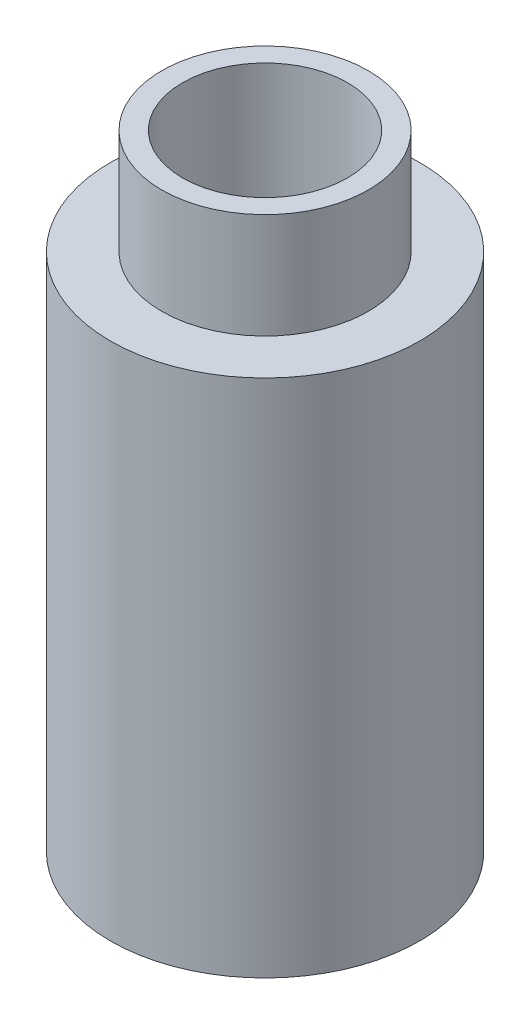
ISO-10303-21;
HEADER;
FILE_DESCRIPTION(('STEP AP214'),'2;1');
FILE_NAME('part.step','',(''),(''),'','','');
FILE_SCHEMA(('AUTOMOTIVE_DESIGN { 1 0 10303 214 1 1 1 1 }'));
ENDSEC;
DATA;
#1=APPLICATION_CONTEXT('core data for automotive mechanical design processes');
#2=APPLICATION_PROTOCOL_DEFINITION('international standard','automotive_design',2000,#1);
#3=PRODUCT_CONTEXT('',#1,'mechanical');
#4=PRODUCT('Part','Part','',(#3));
#5=PRODUCT_RELATED_PRODUCT_CATEGORY('part','',(#4));
#6=PRODUCT_DEFINITION_FORMATION('','',#4);
#7=PRODUCT_DEFINITION_CONTEXT('part definition',#1,'design');
#8=PRODUCT_DEFINITION('design','',#6,#7);
#9=PRODUCT_DEFINITION_SHAPE('','',#8);
#10=(LENGTH_UNIT() NAMED_UNIT(*) SI_UNIT(.MILLI.,.METRE.));
#11=(NAMED_UNIT(*) PLANE_ANGLE_UNIT() SI_UNIT($,.RADIAN.));
#12=(NAMED_UNIT(*) SI_UNIT($,.STERADIAN.) SOLID_ANGLE_UNIT());
#13=UNCERTAINTY_MEASURE_WITH_UNIT(LENGTH_MEASURE(1.E-05),#10,'distance_accuracy_value','');
#14=(GEOMETRIC_REPRESENTATION_CONTEXT(3) GLOBAL_UNCERTAINTY_ASSIGNED_CONTEXT((#13)) GLOBAL_UNIT_ASSIGNED_CONTEXT((#10,
#11,#12)) REPRESENTATION_CONTEXT('',''));
#15=CARTESIAN_POINT('',(0.,0.,0.));
#16=DIRECTION('',(0.,0.,1.));
#17=DIRECTION('',(1.,0.,0.));
#18=AXIS2_PLACEMENT_3D('',#15,#16,#17);
#19=CARTESIAN_POINT('',(0.,31.75,0.));
#20=DIRECTION('',(0.,1.,0.));
#21=DIRECTION('',(0.,0.,1.));
#22=AXIS2_PLACEMENT_3D('',#19,#20,#21);
#23=PLANE('',#22);
#24=CARTESIAN_POINT('',(0.,31.75,0.));
#25=DIRECTION('',(0.,1.,0.));
#26=DIRECTION('',(0.,0.,1.));
#27=AXIS2_PLACEMENT_3D('',#24,#25,#26);
#28=CIRCLE('',#27,9.4488);
#29=CARTESIAN_POINT('',(0.,31.75,9.4488));
#30=VERTEX_POINT('',#29);
#31=EDGE_CURVE('E10',#30,#30,#28,.T.);
#32=ORIENTED_EDGE('',*,*,#31,.T.);
#33=EDGE_LOOP('',(#32));
#34=FACE_BOUND('',#33,.T.);
#35=CARTESIAN_POINT('',(0.,31.75,0.));
#36=DIRECTION('',(0.,1.,0.));
#37=DIRECTION('',(0.,0.,1.));
#38=AXIS2_PLACEMENT_3D('',#35,#36,#37);
#39=CIRCLE('',#38,6.3119);
#40=CARTESIAN_POINT('',(0.,31.75,6.3119));
#41=VERTEX_POINT('',#40);
#42=EDGE_CURVE('E44',#41,#41,#39,.T.);
#43=ORIENTED_EDGE('',*,*,#42,.F.);
#44=EDGE_LOOP('',(#43));
#45=FACE_BOUND('',#44,.T.);
#46=ADVANCED_FACE('F31',(#34,#45),#23,.T.);
#47=CARTESIAN_POINT('',(0.,31.75,0.));
#48=DIRECTION('',(0.,-1.,0.));
#49=DIRECTION('',(0.,0.,-1.));
#50=AXIS2_PLACEMENT_3D('',#47,#48,#49);
#51=CYLINDRICAL_SURFACE('',#50,9.4488);
#52=ORIENTED_EDGE('',*,*,#31,.F.);
#53=EDGE_LOOP('',(#52));
#54=FACE_BOUND('',#53,.T.);
#55=CARTESIAN_POINT('',(0.,0.,0.));
#56=DIRECTION('',(0.,1.,0.));
#57=DIRECTION('',(0.,0.,1.));
#58=AXIS2_PLACEMENT_3D('',#55,#56,#57);
#59=CIRCLE('',#58,9.4488);
#60=CARTESIAN_POINT('',(0.,0.,9.4488));
#61=VERTEX_POINT('',#60);
#62=EDGE_CURVE('E35',#61,#61,#59,.T.);
#63=ORIENTED_EDGE('',*,*,#62,.T.);
#64=EDGE_LOOP('',(#63));
#65=FACE_BOUND('',#64,.T.);
#66=ADVANCED_FACE('F33',(#54,#65),#51,.T.);
#67=CARTESIAN_POINT('',(0.,0.,0.));
#68=DIRECTION('',(0.,1.,0.));
#69=DIRECTION('',(0.,0.,1.));
#70=AXIS2_PLACEMENT_3D('',#67,#68,#69);
#71=PLANE('',#70);
#72=CARTESIAN_POINT('',(0.,0.,0.));
#73=DIRECTION('',(0.,1.,0.));
#74=DIRECTION('',(0.,0.,1.));
#75=AXIS2_PLACEMENT_3D('',#72,#73,#74);
#76=CIRCLE('',#75,5.0419);
#77=CARTESIAN_POINT('',(0.,0.,5.0419));
#78=VERTEX_POINT('',#77);
#79=EDGE_CURVE('E47',#78,#78,#76,.T.);
#80=ORIENTED_EDGE('',*,*,#79,.T.);
#81=EDGE_LOOP('',(#80));
#82=FACE_BOUND('',#81,.T.);
#83=ORIENTED_EDGE('',*,*,#62,.F.);
#84=EDGE_LOOP('',(#83));
#85=FACE_BOUND('',#84,.T.);
#86=ADVANCED_FACE('F56',(#82,#85),#71,.F.);
#87=CARTESIAN_POINT('',(0.,38.1762,0.));
#88=DIRECTION('',(0.,-1.,0.));
#89=DIRECTION('',(0.,0.,-1.));
#90=AXIS2_PLACEMENT_3D('',#87,#88,#89);
#91=CYLINDRICAL_SURFACE('',#90,6.3119);
#92=CARTESIAN_POINT('',(0.,38.1762,0.));
#93=DIRECTION('',(0.,1.,0.));
#94=DIRECTION('',(0.,0.,1.));
#95=AXIS2_PLACEMENT_3D('',#92,#93,#94);
#96=CIRCLE('',#95,6.3119);
#97=CARTESIAN_POINT('',(0.,38.1762,6.3119));
#98=VERTEX_POINT('',#97);
#99=EDGE_CURVE('E42',#98,#98,#96,.T.);
#100=ORIENTED_EDGE('',*,*,#99,.F.);
#101=EDGE_LOOP('',(#100));
#102=FACE_BOUND('',#101,.T.);
#103=ORIENTED_EDGE('',*,*,#42,.T.);
#104=EDGE_LOOP('',(#103));
#105=FACE_BOUND('',#104,.T.);
#106=ADVANCED_FACE('F68',(#102,#105),#91,.T.);
#107=CARTESIAN_POINT('',(0.,38.1762,0.));
#108=DIRECTION('',(0.,1.,0.));
#109=DIRECTION('',(0.,0.,1.));
#110=AXIS2_PLACEMENT_3D('',#107,#108,#109);
#111=PLANE('',#110);
#112=CARTESIAN_POINT('',(0.,38.1762,0.));
#113=DIRECTION('',(0.,1.,0.));
#114=DIRECTION('',(0.,0.,1.));
#115=AXIS2_PLACEMENT_3D('',#112,#113,#114);
#116=CIRCLE('',#115,5.0419);
#117=CARTESIAN_POINT('',(0.,38.1762,5.0419));
#118=VERTEX_POINT('',#117);
#119=EDGE_CURVE('E50',#118,#118,#116,.T.);
#120=ORIENTED_EDGE('',*,*,#119,.F.);
#121=EDGE_LOOP('',(#120));
#122=FACE_BOUND('',#121,.T.);
#123=ORIENTED_EDGE('',*,*,#99,.T.);
#124=EDGE_LOOP('',(#123));
#125=FACE_BOUND('',#124,.T.);
#126=ADVANCED_FACE('F62',(#122,#125),#111,.T.);
#127=CARTESIAN_POINT('',(0.,0.,0.));
#128=DIRECTION('',(0.,1.,0.));
#129=DIRECTION('',(0.,0.,1.));
#130=AXIS2_PLACEMENT_3D('',#127,#128,#129);
#131=CYLINDRICAL_SURFACE('',#130,5.0419);
#132=ORIENTED_EDGE('',*,*,#79,.F.);
#133=EDGE_LOOP('',(#132));
#134=FACE_BOUND('',#133,.T.);
#135=ORIENTED_EDGE('',*,*,#119,.T.);
#136=EDGE_LOOP('',(#135));
#137=FACE_BOUND('',#136,.T.);
#138=ADVANCED_FACE('F59',(#134,#137),#131,.F.);
#139=CLOSED_SHELL('',(#46,#66,#86,#106,#126,#138));
#140=MANIFOLD_SOLID_BREP('B2',#139);
#141=ADVANCED_BREP_SHAPE_REPRESENTATION('',(#18,#140),#14);
#142=SHAPE_DEFINITION_REPRESENTATION(#9,#141);
ENDSEC;
END-ISO-10303-21;
